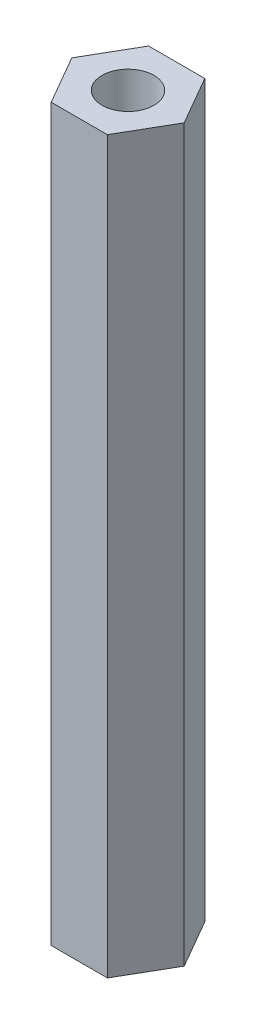
ISO-10303-21;
HEADER;
FILE_DESCRIPTION(('STEP AP214'),'2;1');
FILE_NAME('part.step','',(''),(''),'','','');
FILE_SCHEMA(('AUTOMOTIVE_DESIGN { 1 0 10303 214 1 1 1 1 }'));
ENDSEC;
DATA;
#1=APPLICATION_CONTEXT('core data for automotive mechanical design processes');
#2=APPLICATION_PROTOCOL_DEFINITION('international standard','automotive_design',2000,#1);
#3=PRODUCT_CONTEXT('',#1,'mechanical');
#4=PRODUCT('Part','Part','',(#3));
#5=PRODUCT_RELATED_PRODUCT_CATEGORY('part','',(#4));
#6=PRODUCT_DEFINITION_FORMATION('','',#4);
#7=PRODUCT_DEFINITION_CONTEXT('part definition',#1,'design');
#8=PRODUCT_DEFINITION('design','',#6,#7);
#9=PRODUCT_DEFINITION_SHAPE('','',#8);
#10=(LENGTH_UNIT() NAMED_UNIT(*) SI_UNIT(.MILLI.,.METRE.));
#11=(NAMED_UNIT(*) PLANE_ANGLE_UNIT() SI_UNIT($,.RADIAN.));
#12=(NAMED_UNIT(*) SI_UNIT($,.STERADIAN.) SOLID_ANGLE_UNIT());
#13=UNCERTAINTY_MEASURE_WITH_UNIT(LENGTH_MEASURE(1.E-05),#10,'distance_accuracy_value','');
#14=(GEOMETRIC_REPRESENTATION_CONTEXT(3) GLOBAL_UNCERTAINTY_ASSIGNED_CONTEXT((#13)) GLOBAL_UNIT_ASSIGNED_CONTEXT((#10,
#11,#12)) REPRESENTATION_CONTEXT('',''));
#15=CARTESIAN_POINT('',(0.,0.,0.));
#16=DIRECTION('',(0.,0.,1.));
#17=DIRECTION('',(1.,0.,0.));
#18=AXIS2_PLACEMENT_3D('',#15,#16,#17);
#19=CARTESIAN_POINT('',(0.,45.,0.));
#20=DIRECTION('',(0.,1.,0.));
#21=DIRECTION('',(0.,0.,1.));
#22=AXIS2_PLACEMENT_3D('',#19,#20,#21);
#23=PLANE('',#22);
#24=DIRECTION('',(0.499999999999995,0.,-0.866025403784441));
#25=VECTOR('',#24,1.);
#26=CARTESIAN_POINT('',(1.73205080756891,45.,2.99999999999997));
#27=LINE('',#26,#25);
#28=CARTESIAN_POINT('',(1.73205080756891,45.,2.99999999999997));
#29=VERTEX_POINT('',#28);
#30=CARTESIAN_POINT('',(3.46410161513774,45.,0.));
#31=VERTEX_POINT('',#30);
#32=EDGE_CURVE('E137',#29,#31,#27,.T.);
#33=ORIENTED_EDGE('',*,*,#32,.T.);
#34=DIRECTION('',(-0.500000000000001,0.,-0.866025403784438));
#35=VECTOR('',#34,1.);
#36=CARTESIAN_POINT('',(3.46410161513774,45.,0.));
#37=LINE('',#36,#35);
#38=CARTESIAN_POINT('',(1.73205080756886,45.,-2.99999999999999));
#39=VERTEX_POINT('',#38);
#40=EDGE_CURVE('E95',#31,#39,#37,.T.);
#41=ORIENTED_EDGE('',*,*,#40,.T.);
#42=DIRECTION('',(-1.,0.,0.));
#43=VECTOR('',#42,1.);
#44=CARTESIAN_POINT('',(1.73205080756886,45.,-2.99999999999999));
#45=LINE('',#44,#43);
#46=CARTESIAN_POINT('',(-1.73205080756889,45.,-2.99999999999998));
#47=VERTEX_POINT('',#46);
#48=EDGE_CURVE('E108',#39,#47,#45,.T.);
#49=ORIENTED_EDGE('',*,*,#48,.T.);
#50=DIRECTION('',(-0.499999999999995,0.,0.866025403784442));
#51=VECTOR('',#50,1.);
#52=CARTESIAN_POINT('',(-1.73205080756889,45.,-2.99999999999998));
#53=LINE('',#52,#51);
#54=CARTESIAN_POINT('',(-3.46410161513774,45.,0.));
#55=VERTEX_POINT('',#54);
#56=EDGE_CURVE('E102',#47,#55,#53,.T.);
#57=ORIENTED_EDGE('',*,*,#56,.T.);
#58=DIRECTION('',(0.500000000000007,0.,0.866025403784435));
#59=VECTOR('',#58,1.);
#60=CARTESIAN_POINT('',(-3.46410161513774,45.,0.));
#61=LINE('',#60,#59);
#62=CARTESIAN_POINT('',(-1.73205080756884,45.,3.00000000000001));
#63=VERTEX_POINT('',#62);
#64=EDGE_CURVE('E106',#55,#63,#61,.T.);
#65=ORIENTED_EDGE('',*,*,#64,.T.);
#66=DIRECTION('',(1.,0.,0.));
#67=VECTOR('',#66,1.);
#68=CARTESIAN_POINT('',(-1.73205080756884,45.,3.00000000000001));
#69=LINE('',#68,#67);
#70=EDGE_CURVE('E58',#63,#29,#69,.T.);
#71=ORIENTED_EDGE('',*,*,#70,.T.);
#72=EDGE_LOOP('',(#33,#41,#49,#57,#65,#71));
#73=FACE_BOUND('',#72,.T.);
#74=CARTESIAN_POINT('',(0.,45.,0.));
#75=DIRECTION('',(0.,1.,0.));
#76=DIRECTION('',(0.,0.,1.));
#77=AXIS2_PLACEMENT_3D('',#74,#75,#76);
#78=CIRCLE('',#77,1.6);
#79=CARTESIAN_POINT('',(0.,45.,-1.6));
#80=VERTEX_POINT('',#79);
#81=EDGE_CURVE('E130',#80,#80,#78,.T.);
#82=ORIENTED_EDGE('',*,*,#81,.F.);
#83=EDGE_LOOP('',(#82));
#84=FACE_BOUND('',#83,.T.);
#85=ADVANCED_FACE('F41',(#73,#84),#23,.T.);
#86=CARTESIAN_POINT('',(0.,0.,0.));
#87=DIRECTION('',(0.,1.,0.));
#88=DIRECTION('',(0.,0.,1.));
#89=AXIS2_PLACEMENT_3D('',#86,#87,#88);
#90=PLANE('',#89);
#91=DIRECTION('',(0.499999999999995,0.,-0.866025403784441));
#92=VECTOR('',#91,1.);
#93=CARTESIAN_POINT('',(1.73205080756891,0.,2.99999999999997));
#94=LINE('',#93,#92);
#95=CARTESIAN_POINT('',(1.73205080756891,0.,2.99999999999997));
#96=VERTEX_POINT('',#95);
#97=CARTESIAN_POINT('',(3.46410161513774,0.,0.));
#98=VERTEX_POINT('',#97);
#99=EDGE_CURVE('E126',#96,#98,#94,.T.);
#100=ORIENTED_EDGE('',*,*,#99,.F.);
#101=DIRECTION('',(1.,0.,0.));
#102=VECTOR('',#101,1.);
#103=CARTESIAN_POINT('',(-1.73205080756884,0.,3.00000000000001));
#104=LINE('',#103,#102);
#105=CARTESIAN_POINT('',(-1.73205080756884,0.,3.00000000000001));
#106=VERTEX_POINT('',#105);
#107=EDGE_CURVE('E87',#106,#96,#104,.T.);
#108=ORIENTED_EDGE('',*,*,#107,.F.);
#109=DIRECTION('',(0.500000000000007,0.,0.866025403784435));
#110=VECTOR('',#109,1.);
#111=CARTESIAN_POINT('',(-3.46410161513774,0.,0.));
#112=LINE('',#111,#110);
#113=CARTESIAN_POINT('',(-3.46410161513774,0.,0.));
#114=VERTEX_POINT('',#113);
#115=EDGE_CURVE('E81',#114,#106,#112,.T.);
#116=ORIENTED_EDGE('',*,*,#115,.F.);
#117=DIRECTION('',(-0.499999999999995,0.,0.866025403784442));
#118=VECTOR('',#117,1.);
#119=CARTESIAN_POINT('',(-1.73205080756889,0.,-2.99999999999998));
#120=LINE('',#119,#118);
#121=CARTESIAN_POINT('',(-1.73205080756889,0.,-2.99999999999998));
#122=VERTEX_POINT('',#121);
#123=EDGE_CURVE('E116',#122,#114,#120,.T.);
#124=ORIENTED_EDGE('',*,*,#123,.F.);
#125=DIRECTION('',(-1.,0.,0.));
#126=VECTOR('',#125,1.);
#127=CARTESIAN_POINT('',(1.73205080756886,0.,-2.99999999999999));
#128=LINE('',#127,#126);
#129=CARTESIAN_POINT('',(1.73205080756886,0.,-2.99999999999999));
#130=VERTEX_POINT('',#129);
#131=EDGE_CURVE('E132',#130,#122,#128,.T.);
#132=ORIENTED_EDGE('',*,*,#131,.F.);
#133=DIRECTION('',(-0.500000000000001,0.,-0.866025403784438));
#134=VECTOR('',#133,1.);
#135=CARTESIAN_POINT('',(3.46410161513774,0.,0.));
#136=LINE('',#135,#134);
#137=EDGE_CURVE('E129',#98,#130,#136,.T.);
#138=ORIENTED_EDGE('',*,*,#137,.F.);
#139=EDGE_LOOP('',(#100,#108,#116,#124,#132,#138));
#140=FACE_BOUND('',#139,.T.);
#141=CARTESIAN_POINT('',(0.,0.,0.));
#142=DIRECTION('',(0.,1.,0.));
#143=DIRECTION('',(0.,0.,1.));
#144=AXIS2_PLACEMENT_3D('',#141,#142,#143);
#145=CIRCLE('',#144,1.6);
#146=CARTESIAN_POINT('',(0.,0.,-1.6));
#147=VERTEX_POINT('',#146);
#148=EDGE_CURVE('E236',#147,#147,#145,.T.);
#149=ORIENTED_EDGE('',*,*,#148,.T.);
#150=EDGE_LOOP('',(#149));
#151=FACE_BOUND('',#150,.T.);
#152=ADVANCED_FACE('F146',(#140,#151),#90,.F.);
#153=CARTESIAN_POINT('',(1.73205080756891,45.,2.99999999999997));
#154=DIRECTION('',(-0.866025403784441,0.,-0.499999999999995));
#155=DIRECTION('',(-0.499999999999995,0.,0.866025403784442));
#156=AXIS2_PLACEMENT_3D('',#153,#154,#155);
#157=PLANE('',#156);
#158=ORIENTED_EDGE('',*,*,#99,.T.);
#159=DIRECTION('',(0.,-1.,0.));
#160=VECTOR('',#159,1.);
#161=CARTESIAN_POINT('',(3.46410161513774,45.,0.));
#162=LINE('',#161,#160);
#163=EDGE_CURVE('E11',#31,#98,#162,.T.);
#164=ORIENTED_EDGE('',*,*,#163,.F.);
#165=ORIENTED_EDGE('',*,*,#32,.F.);
#166=DIRECTION('',(0.,-1.,0.));
#167=VECTOR('',#166,1.);
#168=CARTESIAN_POINT('',(1.73205080756891,45.,2.99999999999997));
#169=LINE('',#168,#167);
#170=EDGE_CURVE('E122',#29,#96,#169,.T.);
#171=ORIENTED_EDGE('',*,*,#170,.T.);
#172=EDGE_LOOP('',(#158,#164,#165,#171));
#173=FACE_BOUND('',#172,.T.);
#174=ADVANCED_FACE('F43',(#173),#157,.F.);
#175=CARTESIAN_POINT('',(3.46410161513774,45.,0.));
#176=DIRECTION('',(-0.866025403784438,0.,0.500000000000001));
#177=DIRECTION('',(0.500000000000001,0.,0.866025403784438));
#178=AXIS2_PLACEMENT_3D('',#175,#176,#177);
#179=PLANE('',#178);
#180=ORIENTED_EDGE('',*,*,#137,.T.);
#181=DIRECTION('',(0.,-1.,0.));
#182=VECTOR('',#181,1.);
#183=CARTESIAN_POINT('',(1.73205080756886,45.,-2.99999999999999));
#184=LINE('',#183,#182);
#185=EDGE_CURVE('E50',#39,#130,#184,.T.);
#186=ORIENTED_EDGE('',*,*,#185,.F.);
#187=ORIENTED_EDGE('',*,*,#40,.F.);
#188=ORIENTED_EDGE('',*,*,#163,.T.);
#189=EDGE_LOOP('',(#180,#186,#187,#188));
#190=FACE_BOUND('',#189,.T.);
#191=ADVANCED_FACE('F171',(#190),#179,.F.);
#192=CARTESIAN_POINT('',(1.73205080756886,45.,-2.99999999999999));
#193=DIRECTION('',(0.,0.,1.));
#194=DIRECTION('',(1.,0.,0.));
#195=AXIS2_PLACEMENT_3D('',#192,#193,#194);
#196=PLANE('',#195);
#197=ORIENTED_EDGE('',*,*,#131,.T.);
#198=DIRECTION('',(0.,-1.,0.));
#199=VECTOR('',#198,1.);
#200=CARTESIAN_POINT('',(-1.73205080756889,45.,-2.99999999999998));
#201=LINE('',#200,#199);
#202=EDGE_CURVE('E117',#47,#122,#201,.T.);
#203=ORIENTED_EDGE('',*,*,#202,.F.);
#204=ORIENTED_EDGE('',*,*,#48,.F.);
#205=ORIENTED_EDGE('',*,*,#185,.T.);
#206=EDGE_LOOP('',(#197,#203,#204,#205));
#207=FACE_BOUND('',#206,.T.);
#208=ADVANCED_FACE('F143',(#207),#196,.F.);
#209=CARTESIAN_POINT('',(-1.73205080756889,45.,-2.99999999999998));
#210=DIRECTION('',(0.866025403784442,0.,0.499999999999995));
#211=DIRECTION('',(0.499999999999995,0.,-0.866025403784442));
#212=AXIS2_PLACEMENT_3D('',#209,#210,#211);
#213=PLANE('',#212);
#214=ORIENTED_EDGE('',*,*,#123,.T.);
#215=DIRECTION('',(0.,-1.,0.));
#216=VECTOR('',#215,1.);
#217=CARTESIAN_POINT('',(-3.46410161513774,45.,0.));
#218=LINE('',#217,#216);
#219=EDGE_CURVE('E113',#55,#114,#218,.T.);
#220=ORIENTED_EDGE('',*,*,#219,.F.);
#221=ORIENTED_EDGE('',*,*,#56,.F.);
#222=ORIENTED_EDGE('',*,*,#202,.T.);
#223=EDGE_LOOP('',(#214,#220,#221,#222));
#224=FACE_BOUND('',#223,.T.);
#225=ADVANCED_FACE('F114',(#224),#213,.F.);
#226=CARTESIAN_POINT('',(-3.46410161513774,45.,0.));
#227=DIRECTION('',(0.866025403784434,0.,-0.500000000000007));
#228=DIRECTION('',(-0.500000000000007,0.,-0.866025403784435));
#229=AXIS2_PLACEMENT_3D('',#226,#227,#228);
#230=PLANE('',#229);
#231=ORIENTED_EDGE('',*,*,#115,.T.);
#232=DIRECTION('',(0.,-1.,0.));
#233=VECTOR('',#232,1.);
#234=CARTESIAN_POINT('',(-1.73205080756884,45.,3.00000000000001));
#235=LINE('',#234,#233);
#236=EDGE_CURVE('E118',#63,#106,#235,.T.);
#237=ORIENTED_EDGE('',*,*,#236,.F.);
#238=ORIENTED_EDGE('',*,*,#64,.F.);
#239=ORIENTED_EDGE('',*,*,#219,.T.);
#240=EDGE_LOOP('',(#231,#237,#238,#239));
#241=FACE_BOUND('',#240,.T.);
#242=ADVANCED_FACE('F120',(#241),#230,.F.);
#243=CARTESIAN_POINT('',(-1.73205080756884,45.,3.00000000000001));
#244=DIRECTION('',(0.,0.,-1.));
#245=DIRECTION('',(-1.,0.,0.));
#246=AXIS2_PLACEMENT_3D('',#243,#244,#245);
#247=PLANE('',#246);
#248=ORIENTED_EDGE('',*,*,#107,.T.);
#249=ORIENTED_EDGE('',*,*,#170,.F.);
#250=ORIENTED_EDGE('',*,*,#70,.F.);
#251=ORIENTED_EDGE('',*,*,#236,.T.);
#252=EDGE_LOOP('',(#248,#249,#250,#251));
#253=FACE_BOUND('',#252,.T.);
#254=ADVANCED_FACE('F151',(#253),#247,.F.);
#255=CARTESIAN_POINT('',(0.,45.,0.));
#256=DIRECTION('',(0.,-1.,0.));
#257=DIRECTION('',(0.,0.,-1.));
#258=AXIS2_PLACEMENT_3D('',#255,#256,#257);
#259=CYLINDRICAL_SURFACE('',#258,1.6);
#260=CARTESIAN_POINT('',(0.,45.,-1.6));
#261=CARTESIAN_POINT('',(0.,44.53125,-1.6));
#262=CARTESIAN_POINT('',(0.,44.0625,-1.6));
#263=CARTESIAN_POINT('',(0.,43.125,-1.6));
#264=CARTESIAN_POINT('',(0.,42.65625,-1.6));
#265=CARTESIAN_POINT('',(0.,41.71875,-1.6));
#266=CARTESIAN_POINT('',(0.,41.25,-1.6));
#267=CARTESIAN_POINT('',(0.,40.3125,-1.6));
#268=CARTESIAN_POINT('',(0.,39.84375,-1.6));
#269=CARTESIAN_POINT('',(0.,38.90625,-1.6));
#270=CARTESIAN_POINT('',(0.,38.4375,-1.6));
#271=CARTESIAN_POINT('',(0.,37.5,-1.6));
#272=CARTESIAN_POINT('',(0.,37.03125,-1.6));
#273=CARTESIAN_POINT('',(0.,36.09375,-1.6));
#274=CARTESIAN_POINT('',(0.,35.625,-1.6));
#275=CARTESIAN_POINT('',(0.,34.6875,-1.6));
#276=CARTESIAN_POINT('',(0.,34.21875,-1.6));
#277=CARTESIAN_POINT('',(0.,33.28125,-1.6));
#278=CARTESIAN_POINT('',(0.,32.8125,-1.6));
#279=CARTESIAN_POINT('',(0.,31.875,-1.6));
#280=CARTESIAN_POINT('',(0.,31.40625,-1.6));
#281=CARTESIAN_POINT('',(0.,30.46875,-1.6));
#282=CARTESIAN_POINT('',(0.,30.,-1.6));
#283=CARTESIAN_POINT('',(0.,29.0625,-1.6));
#284=CARTESIAN_POINT('',(0.,28.59375,-1.6));
#285=CARTESIAN_POINT('',(0.,27.65625,-1.6));
#286=CARTESIAN_POINT('',(0.,27.1875,-1.6));
#287=CARTESIAN_POINT('',(0.,26.25,-1.6));
#288=CARTESIAN_POINT('',(0.,25.78125,-1.6));
#289=CARTESIAN_POINT('',(0.,24.84375,-1.6));
#290=CARTESIAN_POINT('',(0.,24.375,-1.6));
#291=CARTESIAN_POINT('',(0.,23.4375,-1.6));
#292=CARTESIAN_POINT('',(0.,22.96875,-1.6));
#293=CARTESIAN_POINT('',(0.,22.03125,-1.6));
#294=CARTESIAN_POINT('',(0.,21.5625,-1.6));
#295=CARTESIAN_POINT('',(0.,20.625,-1.6));
#296=CARTESIAN_POINT('',(0.,20.15625,-1.6));
#297=CARTESIAN_POINT('',(0.,19.21875,-1.6));
#298=CARTESIAN_POINT('',(0.,18.75,-1.6));
#299=CARTESIAN_POINT('',(0.,17.8125,-1.6));
#300=CARTESIAN_POINT('',(0.,17.34375,-1.6));
#301=CARTESIAN_POINT('',(0.,16.40625,-1.6));
#302=CARTESIAN_POINT('',(0.,15.9375,-1.6));
#303=CARTESIAN_POINT('',(0.,15.,-1.6));
#304=CARTESIAN_POINT('',(0.,14.53125,-1.6));
#305=CARTESIAN_POINT('',(0.,13.59375,-1.6));
#306=CARTESIAN_POINT('',(0.,13.125,-1.6));
#307=CARTESIAN_POINT('',(0.,12.1875,-1.6));
#308=CARTESIAN_POINT('',(0.,11.71875,-1.6));
#309=CARTESIAN_POINT('',(0.,10.78125,-1.6));
#310=CARTESIAN_POINT('',(0.,10.3125,-1.6));
#311=CARTESIAN_POINT('',(0.,9.375,-1.6));
#312=CARTESIAN_POINT('',(0.,8.90625,-1.6));
#313=CARTESIAN_POINT('',(0.,7.96874999999999,-1.6));
#314=CARTESIAN_POINT('',(0.,7.5,-1.6));
#315=CARTESIAN_POINT('',(0.,6.5625,-1.6));
#316=CARTESIAN_POINT('',(0.,6.09375,-1.6));
#317=CARTESIAN_POINT('',(0.,5.15625,-1.6));
#318=CARTESIAN_POINT('',(0.,4.68749999999999,-1.6));
#319=CARTESIAN_POINT('',(0.,3.74999999999999,-1.6));
#320=CARTESIAN_POINT('',(0.,3.28124999999999,-1.6));
#321=CARTESIAN_POINT('',(0.,2.34374999999999,-1.6));
#322=CARTESIAN_POINT('',(0.,1.87499999999999,-1.6));
#323=CARTESIAN_POINT('',(0.,0.937499999999992,-1.6));
#324=CARTESIAN_POINT('',(0.,0.468749999999993,-1.6));
#325=CARTESIAN_POINT('',(0.,0.,-1.6));
#326=B_SPLINE_CURVE_WITH_KNOTS('',3,(#260,#261,#262,#263,#264,#265,#266,#267,#268,#269,#270,
#271,#272,#273,#274,#275,#276,#277,#278,#279,#280,#281,#282,#283,#284,#285,#286,#287,#288,#289,
#290,#291,#292,#293,#294,#295,#296,#297,#298,#299,#300,#301,#302,#303,#304,#305,#306,#307,#308,
#309,#310,#311,#312,#313,#314,#315,#316,#317,#318,#319,#320,#321,#322,#323,#324,#325),
.UNSPECIFIED.,.F.,.F.,(4,2,2,2,2,2,2,2,2,2,2,2,2,2,2,2,2,2,2,2,2,2,2,2,2,2,2,2,2,2,2,2,4),(0.,
1.40625,2.8125,4.21875000000001,5.62500000000001,7.03125,8.4375,9.84375000000001,11.25,12.65625,
14.0625,15.46875,16.875,18.28125,19.6875,21.09375,22.5,23.90625,25.3125,26.71875,28.125,
29.53125,30.9375,32.34375,33.75,35.15625,36.5625,37.96875,39.375,40.78125,42.1875,43.59375,45.),.UNSPECIFIED.);
#327=EDGE_CURVE('BSEAM153',#80,#147,#326,.T.);
#328=ORIENTED_EDGE('',*,*,#81,.T.);
#329=ORIENTED_EDGE('',*,*,#148,.F.);
#330=ORIENTED_EDGE('',*,*,#327,.T.);
#331=ORIENTED_EDGE('',*,*,#327,.F.);
#332=EDGE_LOOP('',(#328,#330,#329,#331));
#333=FACE_BOUND('',#332,.T.);
#334=ADVANCED_FACE('F153',(#333),#259,.F.);
#335=CLOSED_SHELL('',(#85,#152,#174,#191,#208,#225,#242,#254,#334));
#336=MANIFOLD_SOLID_BREP('B2',#335);
#337=ADVANCED_BREP_SHAPE_REPRESENTATION('',(#18,#336),#14);
#338=SHAPE_DEFINITION_REPRESENTATION(#9,#337);
ENDSEC;
END-ISO-10303-21;
